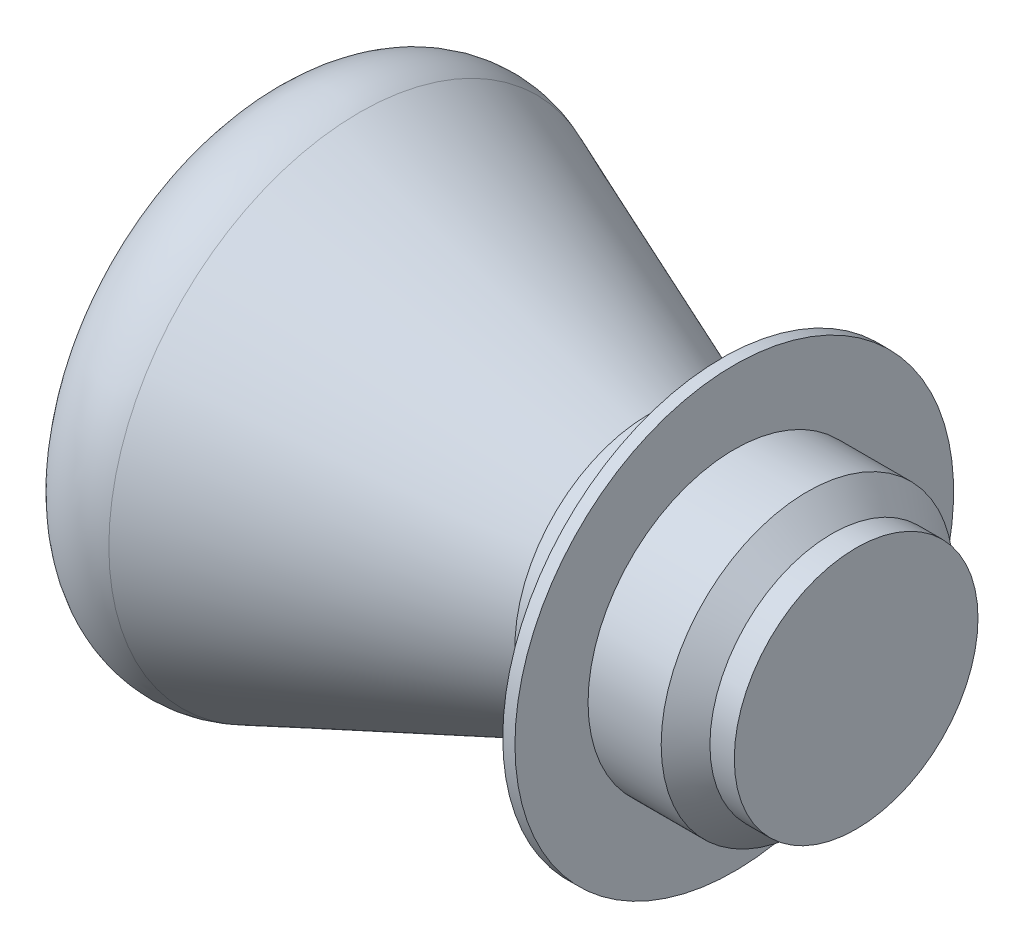
ISO-10303-21;
HEADER;
FILE_DESCRIPTION(('STEP AP214'),'2;1');
FILE_NAME('part.step','',(''),(''),'','','');
FILE_SCHEMA(('AUTOMOTIVE_DESIGN { 1 0 10303 214 1 1 1 1 }'));
ENDSEC;
DATA;
#1=APPLICATION_CONTEXT('core data for automotive mechanical design processes');
#2=APPLICATION_PROTOCOL_DEFINITION('international standard','automotive_design',2000,#1);
#3=PRODUCT_CONTEXT('',#1,'mechanical');
#4=PRODUCT('Part','Part','',(#3));
#5=PRODUCT_RELATED_PRODUCT_CATEGORY('part','',(#4));
#6=PRODUCT_DEFINITION_FORMATION('','',#4);
#7=PRODUCT_DEFINITION_CONTEXT('part definition',#1,'design');
#8=PRODUCT_DEFINITION('design','',#6,#7);
#9=PRODUCT_DEFINITION_SHAPE('','',#8);
#10=(LENGTH_UNIT() NAMED_UNIT(*) SI_UNIT(.MILLI.,.METRE.));
#11=(NAMED_UNIT(*) PLANE_ANGLE_UNIT() SI_UNIT($,.RADIAN.));
#12=(NAMED_UNIT(*) SI_UNIT($,.STERADIAN.) SOLID_ANGLE_UNIT());
#13=UNCERTAINTY_MEASURE_WITH_UNIT(LENGTH_MEASURE(1.E-05),#10,'distance_accuracy_value','');
#14=(GEOMETRIC_REPRESENTATION_CONTEXT(3) GLOBAL_UNCERTAINTY_ASSIGNED_CONTEXT((#13)) GLOBAL_UNIT_ASSIGNED_CONTEXT((#10,
#11,#12)) REPRESENTATION_CONTEXT('',''));
#15=CARTESIAN_POINT('',(0.,0.,0.));
#16=DIRECTION('',(0.,0.,1.));
#17=DIRECTION('',(1.,0.,0.));
#18=AXIS2_PLACEMENT_3D('',#15,#16,#17);
#19=CARTESIAN_POINT('',(0.,0.,0.));
#20=DIRECTION('',(-1.,0.,0.));
#21=DIRECTION('',(0.,-1.,0.));
#22=AXIS2_PLACEMENT_3D('',#19,#20,#21);
#23=PLANE('',#22);
#24=CARTESIAN_POINT('',(0.,0.,0.));
#25=DIRECTION('',(-1.,0.,0.));
#26=DIRECTION('',(0.,-1.,0.));
#27=AXIS2_PLACEMENT_3D('',#24,#25,#26);
#28=CIRCLE('',#27,5.5);
#29=CARTESIAN_POINT('',(0.,-5.5,0.));
#30=VERTEX_POINT('',#29);
#31=EDGE_CURVE('E12',#30,#30,#28,.T.);
#32=ORIENTED_EDGE('',*,*,#31,.F.);
#33=EDGE_LOOP('',(#32));
#34=FACE_BOUND('',#33,.T.);
#35=ADVANCED_FACE('F47',(#34),#23,.F.);
#36=CARTESIAN_POINT('',(-18.3872977573791,0.,0.));
#37=DIRECTION('',(-1.,0.,0.));
#38=DIRECTION('',(0.,-1.,0.));
#39=AXIS2_PLACEMENT_3D('',#36,#37,#38);
#40=CYLINDRICAL_SURFACE('',#39,5.5);
#41=CARTESIAN_POINT('',(-3.,0.,0.));
#42=DIRECTION('',(-1.,0.,0.));
#43=DIRECTION('',(0.,-1.,0.));
#44=AXIS2_PLACEMENT_3D('',#41,#42,#43);
#45=CIRCLE('',#44,5.5);
#46=CARTESIAN_POINT('',(-3.,-5.5,0.));
#47=VERTEX_POINT('',#46);
#48=EDGE_CURVE('E54',#47,#47,#45,.T.);
#49=ORIENTED_EDGE('',*,*,#48,.F.);
#50=EDGE_LOOP('',(#49));
#51=FACE_BOUND('',#50,.T.);
#52=ORIENTED_EDGE('',*,*,#31,.T.);
#53=EDGE_LOOP('',(#52));
#54=FACE_BOUND('',#53,.T.);
#55=ADVANCED_FACE('F78',(#51,#54),#40,.T.);
#56=CARTESIAN_POINT('',(-3.,0.,0.));
#57=DIRECTION('',(-1.,0.,0.));
#58=DIRECTION('',(0.,-1.,0.));
#59=AXIS2_PLACEMENT_3D('',#56,#57,#58);
#60=CONICAL_SURFACE('',#59,5.5,0.382760510475255);
#61=CARTESIAN_POINT('',(-14.8795520760162,0.,0.));
#62=DIRECTION('',(-1.,0.,0.));
#63=DIRECTION('',(0.,-1.,0.));
#64=AXIS2_PLACEMENT_3D('',#61,#62,#63);
#65=CIRCLE('',#64,10.2829115058946);
#66=CARTESIAN_POINT('',(-14.8795520760162,-10.2829115058946,0.));
#67=VERTEX_POINT('',#66);
#68=EDGE_CURVE('E67',#67,#67,#65,.T.);
#69=ORIENTED_EDGE('',*,*,#68,.F.);
#70=EDGE_LOOP('',(#69));
#71=FACE_BOUND('',#70,.T.);
#72=ORIENTED_EDGE('',*,*,#48,.T.);
#73=EDGE_LOOP('',(#72));
#74=FACE_BOUND('',#73,.T.);
#75=ADVANCED_FACE('F76',(#71,#74),#60,.T.);
#76=CARTESIAN_POINT('',(-16.,0.,0.));
#77=DIRECTION('',(-1.,0.,0.));
#78=DIRECTION('',(0.,-1.,0.));
#79=AXIS2_PLACEMENT_3D('',#76,#77,#78);
#80=TOROIDAL_SURFACE('',#79,7.5,3.);
#81=CARTESIAN_POINT('',(-18.9583633040662,0.,0.));
#82=DIRECTION('',(-1.,0.,0.));
#83=DIRECTION('',(0.,-1.,0.));
#84=AXIS2_PLACEMENT_3D('',#81,#82,#83);
#85=CIRCLE('',#84,7.9980828858278);
#86=CARTESIAN_POINT('',(-18.9583633040662,-7.9980828858278,0.));
#87=VERTEX_POINT('',#86);
#88=EDGE_CURVE('E64',#87,#87,#85,.T.);
#89=ORIENTED_EDGE('',*,*,#88,.F.);
#90=EDGE_LOOP('',(#89));
#91=FACE_BOUND('',#90,.T.);
#92=ORIENTED_EDGE('',*,*,#68,.T.);
#93=EDGE_LOOP('',(#92));
#94=FACE_BOUND('',#93,.T.);
#95=ADVANCED_FACE('F60',(#91,#94),#80,.T.);
#96=CARTESIAN_POINT('',(-2.19430458102442,-5.1756131994703,0.));
#97=DIRECTION('',(0.,0.,-1.));
#98=DIRECTION('',(0.,-1.,0.));
#99=AXIS2_PLACEMENT_3D('',#96,#97,#98);
#100=CIRCLE('',#99,17.);
#101=TRIMMED_CURVE('',#100,(PARAMETER_VALUE(-1.88015501947343)),
(PARAMETER_VALUE(1.88015501947343)),.T.,.PARAMETER.);
#102=CARTESIAN_POINT('',(-2.19430458102442,0.,0.));
#103=DIRECTION('',(-1.,0.,0.));
#104=AXIS1_PLACEMENT('',#102,#103);
#105=SURFACE_OF_REVOLUTION('',#101,#104);
#106=CARTESIAN_POINT('',(-18.3872977573791,0.,0.));
#107=VERTEX_POINT('',#106);
#108=VERTEX_LOOP('',#107);
#109=FACE_BOUND('',#108,.T.);
#110=ORIENTED_EDGE('',*,*,#88,.T.);
#111=EDGE_LOOP('',(#110));
#112=FACE_BOUND('',#111,.T.);
#113=ADVANCED_FACE('F57',(#109,#112),#105,.T.);
#114=CLOSED_SHELL('',(#35,#55,#75,#95,#113));
#115=MANIFOLD_SOLID_BREP('B2',#114);
#116=CARTESIAN_POINT('',(0.,5.5,0.));
#117=DIRECTION('',(1.,0.,0.));
#118=DIRECTION('',(0.,0.,-1.));
#119=AXIS2_PLACEMENT_3D('',#116,#117,#118);
#120=PLANE('',#119);
#121=CARTESIAN_POINT('',(0.,0.,0.));
#122=DIRECTION('',(-1.,0.,0.));
#123=DIRECTION('',(0.,0.,1.));
#124=AXIS2_PLACEMENT_3D('',#121,#122,#123);
#125=CIRCLE('',#124,5.5);
#126=CARTESIAN_POINT('',(0.,0.,5.5));
#127=VERTEX_POINT('',#126);
#128=EDGE_CURVE('E157',#127,#127,#125,.T.);
#129=ORIENTED_EDGE('',*,*,#128,.T.);
#130=EDGE_LOOP('',(#129));
#131=FACE_BOUND('',#130,.T.);
#132=ADVANCED_FACE('F123',(#131),#120,.F.);
#133=CARTESIAN_POINT('',(5.5,0.,0.));
#134=DIRECTION('',(-1.,0.,0.));
#135=DIRECTION('',(0.,0.,1.));
#136=AXIS2_PLACEMENT_3D('',#133,#134,#135);
#137=PLANE('',#136);
#138=CARTESIAN_POINT('',(5.5,0.,0.));
#139=DIRECTION('',(-1.,0.,0.));
#140=DIRECTION('',(0.,0.,1.));
#141=AXIS2_PLACEMENT_3D('',#138,#139,#140);
#142=CIRCLE('',#141,5.);
#143=CARTESIAN_POINT('',(5.5,0.,5.));
#144=VERTEX_POINT('',#143);
#145=EDGE_CURVE('E46',#144,#144,#142,.T.);
#146=ORIENTED_EDGE('',*,*,#145,.F.);
#147=EDGE_LOOP('',(#146));
#148=FACE_BOUND('',#147,.T.);
#149=ADVANCED_FACE('F211',(#148),#137,.F.);
#150=CARTESIAN_POINT('',(0.,0.,0.));
#151=DIRECTION('',(-1.,0.,0.));
#152=DIRECTION('',(0.,0.,1.));
#153=AXIS2_PLACEMENT_3D('',#150,#151,#152);
#154=CYLINDRICAL_SURFACE('',#153,5.);
#155=CARTESIAN_POINT('',(4.5,0.,0.));
#156=DIRECTION('',(-1.,0.,0.));
#157=DIRECTION('',(0.,0.,1.));
#158=AXIS2_PLACEMENT_3D('',#155,#156,#157);
#159=CIRCLE('',#158,5.);
#160=CARTESIAN_POINT('',(4.5,0.,5.));
#161=VERTEX_POINT('',#160);
#162=EDGE_CURVE('E129',#161,#161,#159,.T.);
#163=ORIENTED_EDGE('',*,*,#162,.F.);
#164=EDGE_LOOP('',(#163));
#165=FACE_BOUND('',#164,.T.);
#166=ORIENTED_EDGE('',*,*,#145,.T.);
#167=EDGE_LOOP('',(#166));
#168=FACE_BOUND('',#167,.T.);
#169=ADVANCED_FACE('F206',(#165,#168),#154,.T.);
#170=CARTESIAN_POINT('',(4.5,0.,0.));
#171=DIRECTION('',(-1.,0.,0.));
#172=DIRECTION('',(0.,0.,1.));
#173=AXIS2_PLACEMENT_3D('',#170,#171,#172);
#174=CONICAL_SURFACE('',#173,5.,0.785398163397448);
#175=CARTESIAN_POINT('',(3.5,0.,0.));
#176=DIRECTION('',(-1.,0.,0.));
#177=DIRECTION('',(0.,0.,1.));
#178=AXIS2_PLACEMENT_3D('',#175,#176,#177);
#179=CIRCLE('',#178,6.);
#180=CARTESIAN_POINT('',(3.5,0.,6.));
#181=VERTEX_POINT('',#180);
#182=EDGE_CURVE('E133',#181,#181,#179,.T.);
#183=ORIENTED_EDGE('',*,*,#182,.F.);
#184=EDGE_LOOP('',(#183));
#185=FACE_BOUND('',#184,.T.);
#186=ORIENTED_EDGE('',*,*,#162,.T.);
#187=EDGE_LOOP('',(#186));
#188=FACE_BOUND('',#187,.T.);
#189=ADVANCED_FACE('F201',(#185,#188),#174,.T.);
#190=CARTESIAN_POINT('',(0.,0.,0.));
#191=DIRECTION('',(-1.,0.,0.));
#192=DIRECTION('',(0.,0.,1.));
#193=AXIS2_PLACEMENT_3D('',#190,#191,#192);
#194=CYLINDRICAL_SURFACE('',#193,6.);
#195=CARTESIAN_POINT('',(0.5,0.,0.));
#196=DIRECTION('',(-1.,0.,0.));
#197=DIRECTION('',(0.,0.,1.));
#198=AXIS2_PLACEMENT_3D('',#195,#196,#197);
#199=CIRCLE('',#198,6.);
#200=CARTESIAN_POINT('',(0.5,0.,6.));
#201=VERTEX_POINT('',#200);
#202=EDGE_CURVE('E137',#201,#201,#199,.T.);
#203=ORIENTED_EDGE('',*,*,#202,.F.);
#204=EDGE_LOOP('',(#203));
#205=FACE_BOUND('',#204,.T.);
#206=ORIENTED_EDGE('',*,*,#182,.T.);
#207=EDGE_LOOP('',(#206));
#208=FACE_BOUND('',#207,.T.);
#209=ADVANCED_FACE('F195',(#205,#208),#194,.T.);
#210=CARTESIAN_POINT('',(0.5,6.,0.));
#211=DIRECTION('',(-1.,0.,0.));
#212=DIRECTION('',(0.,0.,1.));
#213=AXIS2_PLACEMENT_3D('',#210,#211,#212);
#214=PLANE('',#213);
#215=CARTESIAN_POINT('',(0.5,0.,0.));
#216=DIRECTION('',(-1.,0.,0.));
#217=DIRECTION('',(0.,0.,1.));
#218=AXIS2_PLACEMENT_3D('',#215,#216,#217);
#219=CIRCLE('',#218,9.);
#220=CARTESIAN_POINT('',(0.5,0.,9.));
#221=VERTEX_POINT('',#220);
#222=EDGE_CURVE('E142',#221,#221,#219,.T.);
#223=ORIENTED_EDGE('',*,*,#222,.F.);
#224=EDGE_LOOP('',(#223));
#225=FACE_BOUND('',#224,.T.);
#226=ORIENTED_EDGE('',*,*,#202,.T.);
#227=EDGE_LOOP('',(#226));
#228=FACE_BOUND('',#227,.T.);
#229=ADVANCED_FACE('F189',(#225,#228),#214,.F.);
#230=CARTESIAN_POINT('',(0.,0.,0.));
#231=DIRECTION('',(-1.,0.,0.));
#232=DIRECTION('',(0.,0.,1.));
#233=AXIS2_PLACEMENT_3D('',#230,#231,#232);
#234=CYLINDRICAL_SURFACE('',#233,9.);
#235=CARTESIAN_POINT('',(0.,0.,0.));
#236=DIRECTION('',(-1.,0.,0.));
#237=DIRECTION('',(0.,0.,1.));
#238=AXIS2_PLACEMENT_3D('',#235,#236,#237);
#239=CIRCLE('',#238,9.);
#240=CARTESIAN_POINT('',(0.,0.,9.));
#241=VERTEX_POINT('',#240);
#242=EDGE_CURVE('E145',#241,#241,#239,.T.);
#243=ORIENTED_EDGE('',*,*,#242,.F.);
#244=EDGE_LOOP('',(#243));
#245=FACE_BOUND('',#244,.T.);
#246=ORIENTED_EDGE('',*,*,#222,.T.);
#247=EDGE_LOOP('',(#246));
#248=FACE_BOUND('',#247,.T.);
#249=ADVANCED_FACE('F183',(#245,#248),#234,.T.);
#250=CARTESIAN_POINT('',(0.,9.,0.));
#251=DIRECTION('',(1.,0.,0.));
#252=DIRECTION('',(0.,0.,-1.));
#253=AXIS2_PLACEMENT_3D('',#250,#251,#252);
#254=PLANE('',#253);
#255=CARTESIAN_POINT('',(0.,0.,0.));
#256=DIRECTION('',(-1.,0.,0.));
#257=DIRECTION('',(0.,0.,1.));
#258=AXIS2_PLACEMENT_3D('',#255,#256,#257);
#259=CIRCLE('',#258,6.);
#260=CARTESIAN_POINT('',(0.,0.,6.));
#261=VERTEX_POINT('',#260);
#262=EDGE_CURVE('E148',#261,#261,#259,.T.);
#263=ORIENTED_EDGE('',*,*,#262,.F.);
#264=EDGE_LOOP('',(#263));
#265=FACE_BOUND('',#264,.T.);
#266=ORIENTED_EDGE('',*,*,#242,.T.);
#267=EDGE_LOOP('',(#266));
#268=FACE_BOUND('',#267,.T.);
#269=ADVANCED_FACE('F177',(#265,#268),#254,.F.);
#270=CARTESIAN_POINT('',(0.,0.,0.));
#271=DIRECTION('',(-1.,0.,0.));
#272=DIRECTION('',(0.,0.,1.));
#273=AXIS2_PLACEMENT_3D('',#270,#271,#272);
#274=CYLINDRICAL_SURFACE('',#273,6.);
#275=CARTESIAN_POINT('',(-2.,0.,0.));
#276=DIRECTION('',(-1.,0.,0.));
#277=DIRECTION('',(0.,0.,1.));
#278=AXIS2_PLACEMENT_3D('',#275,#276,#277);
#279=CIRCLE('',#278,6.);
#280=CARTESIAN_POINT('',(-2.,0.,6.));
#281=VERTEX_POINT('',#280);
#282=EDGE_CURVE('E151',#281,#281,#279,.T.);
#283=ORIENTED_EDGE('',*,*,#282,.F.);
#284=EDGE_LOOP('',(#283));
#285=FACE_BOUND('',#284,.T.);
#286=ORIENTED_EDGE('',*,*,#262,.T.);
#287=EDGE_LOOP('',(#286));
#288=FACE_BOUND('',#287,.T.);
#289=ADVANCED_FACE('F171',(#285,#288),#274,.T.);
#290=CARTESIAN_POINT('',(-2.,6.,0.));
#291=DIRECTION('',(1.,0.,0.));
#292=DIRECTION('',(0.,0.,-1.));
#293=AXIS2_PLACEMENT_3D('',#290,#291,#292);
#294=PLANE('',#293);
#295=CARTESIAN_POINT('',(-2.,0.,0.));
#296=DIRECTION('',(-1.,0.,0.));
#297=DIRECTION('',(0.,0.,1.));
#298=AXIS2_PLACEMENT_3D('',#295,#296,#297);
#299=CIRCLE('',#298,5.5);
#300=CARTESIAN_POINT('',(-2.,0.,5.5));
#301=VERTEX_POINT('',#300);
#302=EDGE_CURVE('E154',#301,#301,#299,.T.);
#303=ORIENTED_EDGE('',*,*,#302,.F.);
#304=EDGE_LOOP('',(#303));
#305=FACE_BOUND('',#304,.T.);
#306=ORIENTED_EDGE('',*,*,#282,.T.);
#307=EDGE_LOOP('',(#306));
#308=FACE_BOUND('',#307,.T.);
#309=ADVANCED_FACE('F165',(#305,#308),#294,.F.);
#310=CARTESIAN_POINT('',(0.,0.,0.));
#311=DIRECTION('',(-1.,0.,0.));
#312=DIRECTION('',(0.,0.,1.));
#313=AXIS2_PLACEMENT_3D('',#310,#311,#312);
#314=CYLINDRICAL_SURFACE('',#313,5.5);
#315=ORIENTED_EDGE('',*,*,#128,.F.);
#316=EDGE_LOOP('',(#315));
#317=FACE_BOUND('',#316,.T.);
#318=ORIENTED_EDGE('',*,*,#302,.T.);
#319=EDGE_LOOP('',(#318));
#320=FACE_BOUND('',#319,.T.);
#321=ADVANCED_FACE('F162',(#317,#320),#314,.F.);
#322=CLOSED_SHELL('',(#132,#149,#169,#189,#209,#229,#249,#269,#289,#309,#321));
#323=MANIFOLD_SOLID_BREP('B6',#322);
#324=ADVANCED_BREP_SHAPE_REPRESENTATION('',(#18,#115,#323),#14);
#325=SHAPE_DEFINITION_REPRESENTATION(#9,#324);
ENDSEC;
END-ISO-10303-21;
